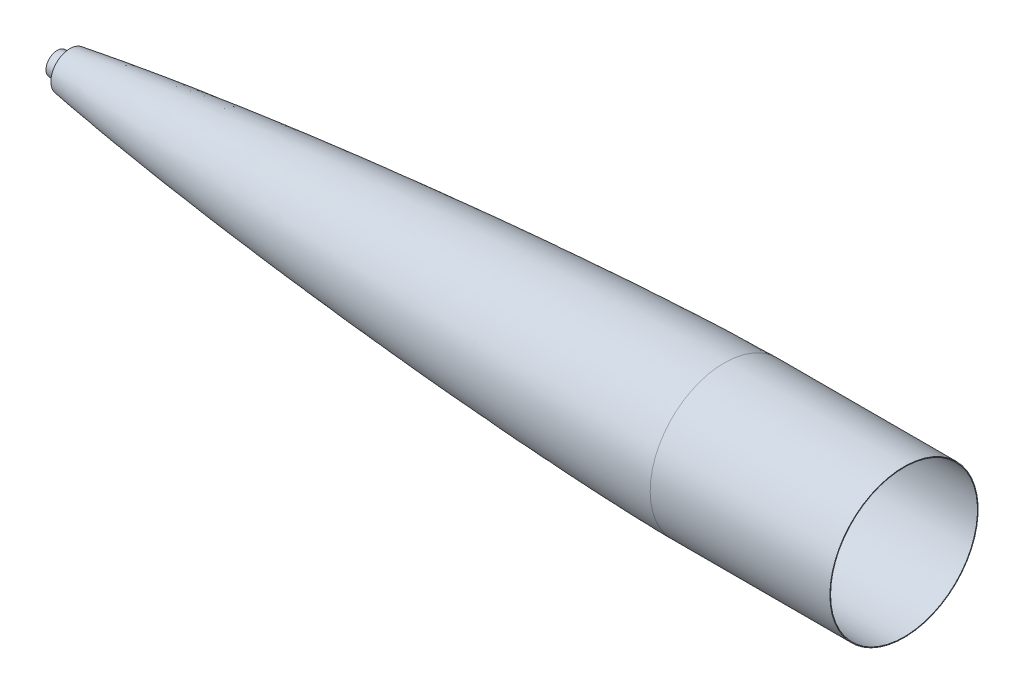
ISO-10303-21;
HEADER;
FILE_DESCRIPTION(('STEP AP214'),'2;1');
FILE_NAME('part.step','',(''),(''),'','','');
FILE_SCHEMA(('AUTOMOTIVE_DESIGN { 1 0 10303 214 1 1 1 1 }'));
ENDSEC;
DATA;
#1=APPLICATION_CONTEXT('core data for automotive mechanical design processes');
#2=APPLICATION_PROTOCOL_DEFINITION('international standard','automotive_design',2000,#1);
#3=PRODUCT_CONTEXT('',#1,'mechanical');
#4=PRODUCT('Part','Part','',(#3));
#5=PRODUCT_RELATED_PRODUCT_CATEGORY('part','',(#4));
#6=PRODUCT_DEFINITION_FORMATION('','',#4);
#7=PRODUCT_DEFINITION_CONTEXT('part definition',#1,'design');
#8=PRODUCT_DEFINITION('design','',#6,#7);
#9=PRODUCT_DEFINITION_SHAPE('','',#8);
#10=(LENGTH_UNIT() NAMED_UNIT(*) SI_UNIT(.MILLI.,.METRE.));
#11=(NAMED_UNIT(*) PLANE_ANGLE_UNIT() SI_UNIT($,.RADIAN.));
#12=(NAMED_UNIT(*) SI_UNIT($,.STERADIAN.) SOLID_ANGLE_UNIT());
#13=UNCERTAINTY_MEASURE_WITH_UNIT(LENGTH_MEASURE(1.E-05),#10,'distance_accuracy_value','');
#14=(GEOMETRIC_REPRESENTATION_CONTEXT(3) GLOBAL_UNCERTAINTY_ASSIGNED_CONTEXT((#13)) GLOBAL_UNIT_ASSIGNED_CONTEXT((#10,
#11,#12)) REPRESENTATION_CONTEXT('',''));
#15=CARTESIAN_POINT('',(0.,0.,0.));
#16=DIRECTION('',(0.,0.,1.));
#17=DIRECTION('',(1.,0.,0.));
#18=AXIS2_PLACEMENT_3D('',#15,#16,#17);
#19=CARTESIAN_POINT('',(0.,0.,0.));
#20=DIRECTION('',(-1.,0.,0.));
#21=DIRECTION('',(0.,0.,1.));
#22=AXIS2_PLACEMENT_3D('',#19,#20,#21);
#23=CYLINDRICAL_SURFACE('',#22,12.7);
#24=CARTESIAN_POINT('',(83.9175540704896,0.,0.));
#25=DIRECTION('',(-1.,0.,0.));
#26=DIRECTION('',(0.,0.,1.));
#27=AXIS2_PLACEMENT_3D('',#24,#25,#26);
#28=CIRCLE('',#27,12.7);
#29=CARTESIAN_POINT('',(83.9175540704896,0.,12.7));
#30=VERTEX_POINT('',#29);
#31=EDGE_CURVE('E65',#30,#30,#28,.T.);
#32=ORIENTED_EDGE('',*,*,#31,.F.);
#33=EDGE_LOOP('',(#32));
#34=FACE_BOUND('',#33,.T.);
#35=CARTESIAN_POINT('',(96.6175540704896,0.,0.));
#36=DIRECTION('',(-1.,0.,0.));
#37=DIRECTION('',(0.,0.,1.));
#38=AXIS2_PLACEMENT_3D('',#35,#36,#37);
#39=CIRCLE('',#38,12.7);
#40=CARTESIAN_POINT('',(96.6175540704896,0.,12.7));
#41=VERTEX_POINT('',#40);
#42=EDGE_CURVE('E10',#41,#41,#39,.T.);
#43=ORIENTED_EDGE('',*,*,#42,.T.);
#44=EDGE_LOOP('',(#43));
#45=FACE_BOUND('',#44,.T.);
#46=ADVANCED_FACE('F31',(#34,#45),#23,.T.);
#47=CARTESIAN_POINT('',(98.1635682934683,0.,0.));
#48=DIRECTION('',(1.,0.,0.));
#49=DIRECTION('',(0.,0.,-1.));
#50=AXIS2_PLACEMENT_3D('',#47,#48,#49);
#51=CONICAL_SURFACE('',#50,21.4678823555437,1.3962634015934);
#52=ORIENTED_EDGE('',*,*,#42,.F.);
#53=EDGE_LOOP('',(#52));
#54=FACE_BOUND('',#53,.T.);
#55=CARTESIAN_POINT('',(98.1635682934683,0.,0.));
#56=DIRECTION('',(-1.,0.,0.));
#57=DIRECTION('',(0.,0.,1.));
#58=AXIS2_PLACEMENT_3D('',#55,#56,#57);
#59=CIRCLE('',#58,21.4678823555437);
#60=CARTESIAN_POINT('',(98.1635682934683,0.,21.4678823555437));
#61=VERTEX_POINT('',#60);
#62=EDGE_CURVE('E37',#61,#61,#59,.T.);
#63=ORIENTED_EDGE('',*,*,#62,.T.);
#64=EDGE_LOOP('',(#63));
#65=FACE_BOUND('',#64,.T.);
#66=ADVANCED_FACE('F83',(#54,#65),#51,.T.);
#67=CARTESIAN_POINT('',(838.2,83.82,0.));
#68=CARTESIAN_POINT('',(835.489248783608,83.8132601169452,0.));
#69=CARTESIAN_POINT('',(830.067936092992,83.7619227730436,0.));
#70=CARTESIAN_POINT('',(819.226060022886,83.6010160668581,0.));
#71=CARTESIAN_POINT('',(801.909834210439,83.2142821288757,0.));
#72=CARTESIAN_POINT('',(780.831665682578,82.5979748954525,0.));
#73=CARTESIAN_POINT('',(749.520698446852,81.4713954580175,0.));
#74=CARTESIAN_POINT('',(710.693213075303,79.7712983267604,0.));
#75=CARTESIAN_POINT('',(665.411655564777,77.427095787684,0.));
#76=CARTESIAN_POINT('',(613.685068308062,74.3251475114203,0.));
#77=CARTESIAN_POINT('',(561.982906562161,70.8407285423232,0.));
#78=CARTESIAN_POINT('',(510.306365900539,66.9955304767201,0.));
#79=CARTESIAN_POINT('',(458.657158448388,62.7990726167157,0.));
#80=CARTESIAN_POINT('',(407.037815129638,58.2500710412866,0.));
#81=CARTESIAN_POINT('',(355.451699359427,53.3377931523086,0.));
#82=CARTESIAN_POINT('',(303.903852309247,48.03882100725,0.));
#83=CARTESIAN_POINT('',(252.401123307036,42.3159248194991,0.));
#84=CARTESIAN_POINT('',(200.954778344129,36.1056904837407,0.));
#85=CARTESIAN_POINT('',(155.955742041513,30.1523774015375,0.));
#86=CARTESIAN_POINT('',(123.856103976554,25.4937610306325,0.));
#87=CARTESIAN_POINT('',(104.607343895741,22.4977343441118,0.));
#88=CARTESIAN_POINT('',(98.1635682934683,21.4678823555437,0.));
#89=B_SPLINE_CURVE_WITH_KNOTS('',4,(#67,#68,#69,#70,#71,#72,#73,#74,#75,#76,#77,#78,#79,#80,#81,
#82,#83,#84,#85,#86,#87,#88),.UNSPECIFIED.,.F.,.F.,(5,1,1,1,1,1,1,1,1,1,1,1,1,1,1,1,1,1,5),
(0.11938249851022,0.132231734321944,0.145080970133668,0.170779441757117,0.201482859362511,
0.232186276967905,0.293593112657566,0.354999947096596,0.416406782227813,0.477813617928748,
0.539220452781133,0.600627287358869,0.662034122194719,0.723440957161642,0.784847792089017,
0.84625462671534,0.907661460641354,0.9690682936427,1.),.UNSPECIFIED.);
#90=CARTESIAN_POINT('',(0.,0.,0.));
#91=DIRECTION('',(-1.,0.,0.));
#92=AXIS1_PLACEMENT('',#90,#91);
#93=SURFACE_OF_REVOLUTION('',#89,#92);
#94=ORIENTED_EDGE('',*,*,#62,.F.);
#95=EDGE_LOOP('',(#94));
#96=FACE_BOUND('',#95,.T.);
#97=CARTESIAN_POINT('',(838.2,0.,0.));
#98=DIRECTION('',(-1.,0.,0.));
#99=DIRECTION('',(0.,0.,1.));
#100=AXIS2_PLACEMENT_3D('',#97,#98,#99);
#101=CIRCLE('',#100,83.82);
#102=CARTESIAN_POINT('',(838.2,0.,83.82));
#103=VERTEX_POINT('',#102);
#104=EDGE_CURVE('E41',#103,#103,#101,.T.);
#105=ORIENTED_EDGE('',*,*,#104,.T.);
#106=EDGE_LOOP('',(#105));
#107=FACE_BOUND('',#106,.T.);
#108=ADVANCED_FACE('F79',(#96,#107),#93,.T.);
#109=CARTESIAN_POINT('',(0.,0.,0.));
#110=DIRECTION('',(-1.,0.,0.));
#111=DIRECTION('',(0.,0.,1.));
#112=AXIS2_PLACEMENT_3D('',#109,#110,#111);
#113=CYLINDRICAL_SURFACE('',#112,83.82);
#114=ORIENTED_EDGE('',*,*,#104,.F.);
#115=EDGE_LOOP('',(#114));
#116=FACE_BOUND('',#115,.T.);
#117=CARTESIAN_POINT('',(1041.4,0.,0.));
#118=DIRECTION('',(-1.,0.,0.));
#119=DIRECTION('',(0.,0.,1.));
#120=AXIS2_PLACEMENT_3D('',#117,#118,#119);
#121=CIRCLE('',#120,83.8199999999999);
#122=CARTESIAN_POINT('',(1041.4,0.,83.8199999999999));
#123=VERTEX_POINT('',#122);
#124=EDGE_CURVE('E45',#123,#123,#121,.T.);
#125=ORIENTED_EDGE('',*,*,#124,.T.);
#126=EDGE_LOOP('',(#125));
#127=FACE_BOUND('',#126,.T.);
#128=ADVANCED_FACE('F82',(#116,#127),#113,.T.);
#129=CARTESIAN_POINT('',(1041.4,83.8199999999999,0.));
#130=DIRECTION('',(1.,0.,0.));
#131=DIRECTION('',(0.,0.,-1.));
#132=AXIS2_PLACEMENT_3D('',#129,#130,#131);
#133=PLANE('',#132);
#134=CARTESIAN_POINT('',(1041.4,0.,0.));
#135=DIRECTION('',(-1.,0.,0.));
#136=DIRECTION('',(0.,0.,1.));
#137=AXIS2_PLACEMENT_3D('',#134,#135,#136);
#138=CIRCLE('',#137,83.0579999999999);
#139=CARTESIAN_POINT('',(1041.4,0.,83.0579999999999));
#140=VERTEX_POINT('',#139);
#141=EDGE_CURVE('E50',#140,#140,#138,.T.);
#142=ORIENTED_EDGE('',*,*,#141,.T.);
#143=EDGE_LOOP('',(#142));
#144=FACE_BOUND('',#143,.T.);
#145=ORIENTED_EDGE('',*,*,#124,.F.);
#146=EDGE_LOOP('',(#145));
#147=FACE_BOUND('',#146,.T.);
#148=ADVANCED_FACE('F123',(#144,#147),#133,.T.);
#149=CARTESIAN_POINT('',(0.,0.,0.));
#150=DIRECTION('',(-1.,0.,0.));
#151=DIRECTION('',(0.,0.,1.));
#152=AXIS2_PLACEMENT_3D('',#149,#150,#151);
#153=CYLINDRICAL_SURFACE('',#152,83.0579988206117);
#154=CARTESIAN_POINT('',(838.200000005873,0.,0.));
#155=DIRECTION('',(-1.,0.,0.));
#156=DIRECTION('',(0.,0.,1.));
#157=AXIS2_PLACEMENT_3D('',#154,#155,#156);
#158=CIRCLE('',#157,83.0579976412234);
#159=CARTESIAN_POINT('',(838.200000005873,0.,83.0579976412234));
#160=VERTEX_POINT('',#159);
#161=EDGE_CURVE('E53',#160,#160,#158,.T.);
#162=ORIENTED_EDGE('',*,*,#161,.T.);
#163=EDGE_LOOP('',(#162));
#164=FACE_BOUND('',#163,.T.);
#165=ORIENTED_EDGE('',*,*,#141,.F.);
#166=EDGE_LOOP('',(#165));
#167=FACE_BOUND('',#166,.T.);
#168=ADVANCED_FACE('F117',(#164,#167),#153,.F.);
#169=CARTESIAN_POINT('',(838.200000005873,83.0579976412235,0.));
#170=CARTESIAN_POINT('',(834.338107035007,83.0483814587155,0.));
#171=CARTESIAN_POINT('',(830.472695766527,83.0000580069886,0.));
#172=CARTESIAN_POINT('',(822.742007870267,82.8848009322981,0.));
#173=CARTESIAN_POINT('',(818.876536257568,82.8136220223694,0.));
#174=CARTESIAN_POINT('',(807.280295026721,82.5706015092063,0.));
#175=CARTESIAN_POINT('',(799.549651827724,82.369584682829,0.));
#176=CARTESIAN_POINT('',(776.359635598914,81.6870788746185,0.));
#177=CARTESIAN_POINT('',(760.902047562869,81.1245800432146,0.));
#178=CARTESIAN_POINT('',(729.992659512814,79.8508034098277,0.));
#179=CARTESIAN_POINT('',(714.540837957192,79.137680265783,0.));
#180=CARTESIAN_POINT('',(683.643178493167,77.586993435167,0.));
#181=CARTESIAN_POINT('',(668.19734976916,76.7490889808323,0.));
#182=CARTESIAN_POINT('',(621.869173836655,74.0702102681697,0.));
#183=CARTESIAN_POINT('',(590.996095388711,72.0656966860081,0.));
#184=CARTESIAN_POINT('',(529.277112445592,67.6745344545178,0.));
#185=CARTESIAN_POINT('',(498.431164814856,65.2871123237433,0.));
#186=CARTESIAN_POINT('',(436.770639073691,60.1379895636701,0.));
#187=CARTESIAN_POINT('',(405.955984103985,57.3763537768452,0.));
#188=CARTESIAN_POINT('',(344.365506881499,51.4524933301581,0.));
#189=CARTESIAN_POINT('',(313.589509482289,48.2910689507363,0.));
#190=CARTESIAN_POINT('',(267.465339900164,43.1928405430984,0.));
#191=CARTESIAN_POINT('',(252.097337290024,41.4335933346202,0.));
#192=CARTESIAN_POINT('',(221.378093031817,37.7772020121204,0.));
#193=CARTESIAN_POINT('',(206.026759196874,35.880434641097,0.));
#194=CARTESIAN_POINT('',(175.3461027318,31.9205855233707,0.));
#195=CARTESIAN_POINT('',(160.016659418382,29.8580027082595,0.));
#196=CARTESIAN_POINT('',(129.389643961097,25.5155492742727,0.));
#197=CARTESIAN_POINT('',(114.091449833663,23.2377888803376,0.));
#198=CARTESIAN_POINT('',(98.8197360933583,20.8010117616285,0.));
#199=B_SPLINE_CURVE_WITH_KNOTS('',3,(#169,#170,#171,#172,#173,#174,#175,#176,#177,#178,#179,
#180,#181,#182,#183,#184,#185,#186,#187,#188,#189,#190,#191,#192,#193,#194,#195,#196,#197,#198),
.UNSPECIFIED.,.F.,.F.,(4,2,2,2,2,2,2,2,2,2,2,2,2,2,4),(0.,0.0156249999999998,0.0312499999999997,
0.0624999999999998,0.125,0.1875,0.249999999999999,0.375,0.5,0.625,0.75,0.8125,0.875,0.9375,1.),.UNSPECIFIED.);
#200=CARTESIAN_POINT('',(0.,0.,0.));
#201=DIRECTION('',(-1.,0.,0.));
#202=AXIS1_PLACEMENT('',#200,#201);
#203=SURFACE_OF_REVOLUTION('',#199,#202);
#204=CARTESIAN_POINT('',(98.8197360933583,0.,0.));
#205=DIRECTION('',(-1.,0.,0.));
#206=DIRECTION('',(0.,0.,1.));
#207=AXIS2_PLACEMENT_3D('',#204,#205,#206);
#208=CIRCLE('',#207,20.8010117616285);
#209=CARTESIAN_POINT('',(98.8197360933583,0.,20.8010117616285));
#210=VERTEX_POINT('',#209);
#211=EDGE_CURVE('E56',#210,#210,#208,.T.);
#212=ORIENTED_EDGE('',*,*,#211,.T.);
#213=EDGE_LOOP('',(#212));
#214=FACE_BOUND('',#213,.T.);
#215=ORIENTED_EDGE('',*,*,#161,.F.);
#216=EDGE_LOOP('',(#215));
#217=FACE_BOUND('',#216,.T.);
#218=ADVANCED_FACE('F111',(#214,#217),#203,.F.);
#219=CARTESIAN_POINT('',(98.8197360933583,0.,0.));
#220=DIRECTION('',(1.,0.,0.));
#221=DIRECTION('',(0.,0.,-1.));
#222=AXIS2_PLACEMENT_3D('',#219,#220,#221);
#223=CONICAL_SURFACE('',#222,20.8010117616285,1.39626340159546);
#224=CARTESIAN_POINT('',(97.2569479894467,0.,0.));
#225=DIRECTION('',(-1.,0.,0.));
#226=DIRECTION('',(0.,0.,1.));
#227=AXIS2_PLACEMENT_3D('',#224,#225,#226);
#228=CIRCLE('',#227,11.938);
#229=CARTESIAN_POINT('',(97.2569479894467,0.,11.938));
#230=VERTEX_POINT('',#229);
#231=EDGE_CURVE('E59',#230,#230,#228,.T.);
#232=ORIENTED_EDGE('',*,*,#231,.T.);
#233=EDGE_LOOP('',(#232));
#234=FACE_BOUND('',#233,.T.);
#235=ORIENTED_EDGE('',*,*,#211,.F.);
#236=EDGE_LOOP('',(#235));
#237=FACE_BOUND('',#236,.T.);
#238=ADVANCED_FACE('F105',(#234,#237),#223,.F.);
#239=CARTESIAN_POINT('',(0.,0.,0.));
#240=DIRECTION('',(-1.,0.,0.));
#241=DIRECTION('',(0.,0.,1.));
#242=AXIS2_PLACEMENT_3D('',#239,#240,#241);
#243=CYLINDRICAL_SURFACE('',#242,11.938);
#244=CARTESIAN_POINT('',(83.9175540704896,0.,0.));
#245=DIRECTION('',(-1.,0.,0.));
#246=DIRECTION('',(0.,0.,1.));
#247=AXIS2_PLACEMENT_3D('',#244,#245,#246);
#248=CIRCLE('',#247,11.938);
#249=CARTESIAN_POINT('',(83.9175540704896,0.,11.938));
#250=VERTEX_POINT('',#249);
#251=EDGE_CURVE('E62',#250,#250,#248,.T.);
#252=ORIENTED_EDGE('',*,*,#251,.T.);
#253=EDGE_LOOP('',(#252));
#254=FACE_BOUND('',#253,.T.);
#255=ORIENTED_EDGE('',*,*,#231,.F.);
#256=EDGE_LOOP('',(#255));
#257=FACE_BOUND('',#256,.T.);
#258=ADVANCED_FACE('F99',(#254,#257),#243,.F.);
#259=CARTESIAN_POINT('',(83.9175540704896,11.938,0.));
#260=DIRECTION('',(-1.,0.,0.));
#261=DIRECTION('',(0.,0.,1.));
#262=AXIS2_PLACEMENT_3D('',#259,#260,#261);
#263=PLANE('',#262);
#264=ORIENTED_EDGE('',*,*,#31,.T.);
#265=EDGE_LOOP('',(#264));
#266=FACE_BOUND('',#265,.T.);
#267=ORIENTED_EDGE('',*,*,#251,.F.);
#268=EDGE_LOOP('',(#267));
#269=FACE_BOUND('',#268,.T.);
#270=ADVANCED_FACE('F96',(#266,#269),#263,.T.);
#271=CLOSED_SHELL('',(#46,#66,#108,#128,#148,#168,#218,#238,#258,#270));
#272=MANIFOLD_SOLID_BREP('B2',#271);
#273=ADVANCED_BREP_SHAPE_REPRESENTATION('',(#18,#272),#14);
#274=SHAPE_DEFINITION_REPRESENTATION(#9,#273);
ENDSEC;
END-ISO-10303-21;
